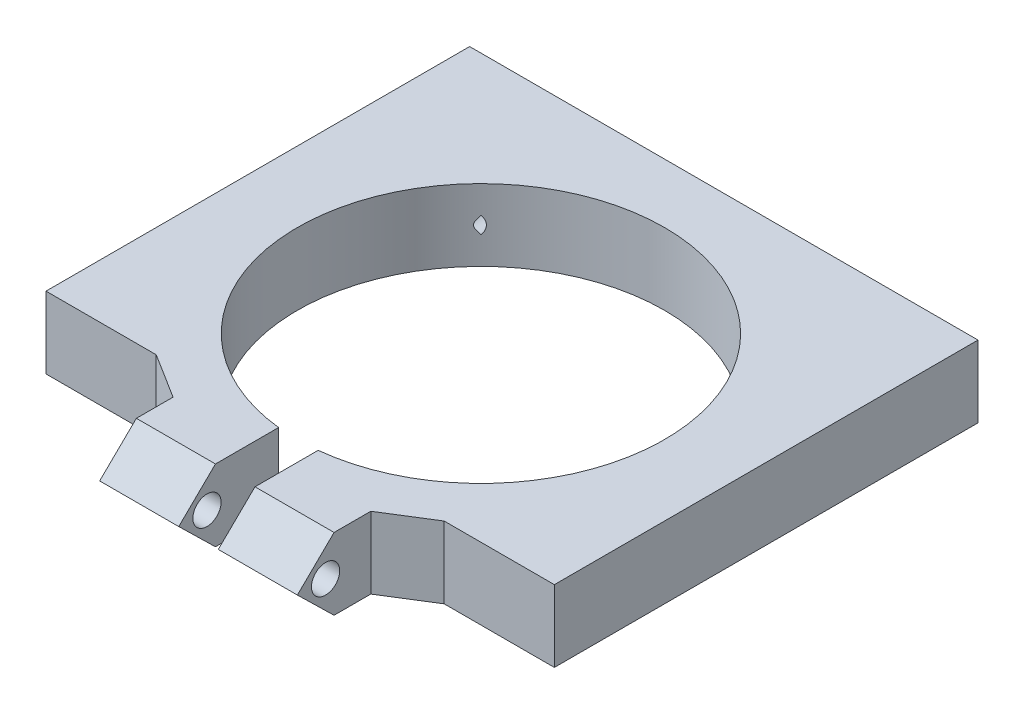
ISO-10303-21;
HEADER;
FILE_DESCRIPTION(('STEP AP214'),'2;1');
FILE_NAME('part.step','',(''),(''),'','','');
FILE_SCHEMA(('AUTOMOTIVE_DESIGN { 1 0 10303 214 1 1 1 1 }'));
ENDSEC;
DATA;
#1=APPLICATION_CONTEXT('core data for automotive mechanical design processes');
#2=APPLICATION_PROTOCOL_DEFINITION('international standard','automotive_design',2000,#1);
#3=PRODUCT_CONTEXT('',#1,'mechanical');
#4=PRODUCT('Part','Part','',(#3));
#5=PRODUCT_RELATED_PRODUCT_CATEGORY('part','',(#4));
#6=PRODUCT_DEFINITION_FORMATION('','',#4);
#7=PRODUCT_DEFINITION_CONTEXT('part definition',#1,'design');
#8=PRODUCT_DEFINITION('design','',#6,#7);
#9=PRODUCT_DEFINITION_SHAPE('','',#8);
#10=(LENGTH_UNIT() NAMED_UNIT(*) SI_UNIT(.MILLI.,.METRE.));
#11=(NAMED_UNIT(*) PLANE_ANGLE_UNIT() SI_UNIT($,.RADIAN.));
#12=(NAMED_UNIT(*) SI_UNIT($,.STERADIAN.) SOLID_ANGLE_UNIT());
#13=UNCERTAINTY_MEASURE_WITH_UNIT(LENGTH_MEASURE(1.E-05),#10,'distance_accuracy_value','');
#14=(GEOMETRIC_REPRESENTATION_CONTEXT(3) GLOBAL_UNCERTAINTY_ASSIGNED_CONTEXT((#13)) GLOBAL_UNIT_ASSIGNED_CONTEXT((#10,
#11,#12)) REPRESENTATION_CONTEXT('',''));
#15=CARTESIAN_POINT('',(0.,0.,0.));
#16=DIRECTION('',(0.,0.,1.));
#17=DIRECTION('',(1.,0.,0.));
#18=AXIS2_PLACEMENT_3D('',#15,#16,#17);
#19=CARTESIAN_POINT('',(45.,0.,-46.5));
#20=DIRECTION('',(0.,-1.,0.));
#21=DIRECTION('',(0.,0.,-1.));
#22=AXIS2_PLACEMENT_3D('',#19,#20,#21);
#23=PLANE('',#22);
#24=DIRECTION('',(-0.847998304005088,0.,0.52999894000318));
#25=VECTOR('',#24,1.);
#26=CARTESIAN_POINT('',(25.5,0.,28.5));
#27=LINE('',#26,#25);
#28=CARTESIAN_POINT('',(25.5,0.,28.5));
#29=VERTEX_POINT('',#28);
#30=CARTESIAN_POINT('',(17.5,0.,33.5));
#31=VERTEX_POINT('',#30);
#32=EDGE_CURVE('E219',#29,#31,#27,.T.);
#33=ORIENTED_EDGE('',*,*,#32,.T.);
#34=DIRECTION('',(0.,0.,1.));
#35=VECTOR('',#34,1.);
#36=CARTESIAN_POINT('',(17.5,0.,46.5));
#37=LINE('',#36,#35);
#38=CARTESIAN_POINT('',(17.5,0.,40.));
#39=VERTEX_POINT('',#38);
#40=EDGE_CURVE('E310',#31,#39,#37,.T.);
#41=ORIENTED_EDGE('',*,*,#40,.T.);
#42=DIRECTION('',(-1.,0.,0.));
#43=VECTOR('',#42,1.);
#44=CARTESIAN_POINT('',(26.5869411795169,0.,40.));
#45=LINE('',#44,#43);
#46=CARTESIAN_POINT('',(3.50000000000001,0.,40.));
#47=VERTEX_POINT('',#46);
#48=EDGE_CURVE('E250',#39,#47,#45,.T.);
#49=ORIENTED_EDGE('',*,*,#48,.T.);
#50=DIRECTION('',(0.,0.,-1.));
#51=VECTOR('',#50,1.);
#52=CARTESIAN_POINT('',(3.50000000000001,0.,46.5));
#53=LINE('',#52,#51);
#54=CARTESIAN_POINT('',(3.50000000000001,0.,28.8210473221398));
#55=VERTEX_POINT('',#54);
#56=EDGE_CURVE('E292',#47,#55,#53,.T.);
#57=ORIENTED_EDGE('',*,*,#56,.T.);
#58=CARTESIAN_POINT('',(0.,0.,-3.5));
#59=DIRECTION('',(0.,1.,0.));
#60=DIRECTION('',(0.,0.,1.));
#61=AXIS2_PLACEMENT_3D('',#58,#59,#60);
#62=CIRCLE('',#61,32.51);
#63=CARTESIAN_POINT('',(-3.49999999999999,0.,28.8210473221398));
#64=VERTEX_POINT('',#63);
#65=EDGE_CURVE('E320',#55,#64,#62,.T.);
#66=ORIENTED_EDGE('',*,*,#65,.T.);
#67=DIRECTION('',(0.,0.,1.));
#68=VECTOR('',#67,1.);
#69=CARTESIAN_POINT('',(-3.49999999999999,0.,46.5));
#70=LINE('',#69,#68);
#71=CARTESIAN_POINT('',(-3.49999999999999,0.,40.));
#72=VERTEX_POINT('',#71);
#73=EDGE_CURVE('E299',#64,#72,#70,.T.);
#74=ORIENTED_EDGE('',*,*,#73,.T.);
#75=CARTESIAN_POINT('',(-17.5,0.,40.));
#76=VERTEX_POINT('',#75);
#77=EDGE_CURVE('E254',#72,#76,#45,.T.);
#78=ORIENTED_EDGE('',*,*,#77,.T.);
#79=DIRECTION('',(0.,0.,-1.));
#80=VECTOR('',#79,1.);
#81=CARTESIAN_POINT('',(-17.5,0.,46.5));
#82=LINE('',#81,#80);
#83=CARTESIAN_POINT('',(-17.5,0.,33.5));
#84=VERTEX_POINT('',#83);
#85=EDGE_CURVE('E302',#76,#84,#82,.T.);
#86=ORIENTED_EDGE('',*,*,#85,.T.);
#87=DIRECTION('',(-0.847998304005088,0.,-0.52999894000318));
#88=VECTOR('',#87,1.);
#89=CARTESIAN_POINT('',(-25.5,0.,28.5));
#90=LINE('',#89,#88);
#91=CARTESIAN_POINT('',(-25.5,0.,28.5));
#92=VERTEX_POINT('',#91);
#93=EDGE_CURVE('E234',#84,#92,#90,.T.);
#94=ORIENTED_EDGE('',*,*,#93,.T.);
#95=DIRECTION('',(-1.,0.,0.));
#96=VECTOR('',#95,1.);
#97=CARTESIAN_POINT('',(-45.,0.,28.5));
#98=LINE('',#97,#96);
#99=CARTESIAN_POINT('',(-45.,0.,28.5));
#100=VERTEX_POINT('',#99);
#101=EDGE_CURVE('E237',#92,#100,#98,.T.);
#102=ORIENTED_EDGE('',*,*,#101,.T.);
#103=DIRECTION('',(0.,0.,1.));
#104=VECTOR('',#103,1.);
#105=CARTESIAN_POINT('',(-45.,0.,-46.5));
#106=LINE('',#105,#104);
#107=CARTESIAN_POINT('',(-45.,0.,-46.5));
#108=VERTEX_POINT('',#107);
#109=EDGE_CURVE('E330',#108,#100,#106,.T.);
#110=ORIENTED_EDGE('',*,*,#109,.F.);
#111=DIRECTION('',(1.,0.,0.));
#112=VECTOR('',#111,1.);
#113=CARTESIAN_POINT('',(-45.,0.,-46.5));
#114=LINE('',#113,#112);
#115=CARTESIAN_POINT('',(45.,0.,-46.5));
#116=VERTEX_POINT('',#115);
#117=EDGE_CURVE('E323',#108,#116,#114,.T.);
#118=ORIENTED_EDGE('',*,*,#117,.T.);
#119=DIRECTION('',(0.,0.,1.));
#120=VECTOR('',#119,1.);
#121=CARTESIAN_POINT('',(45.,0.,-46.5));
#122=LINE('',#121,#120);
#123=CARTESIAN_POINT('',(45.,0.,28.5));
#124=VERTEX_POINT('',#123);
#125=EDGE_CURVE('E339',#116,#124,#122,.T.);
#126=ORIENTED_EDGE('',*,*,#125,.T.);
#127=DIRECTION('',(-1.,0.,0.));
#128=VECTOR('',#127,1.);
#129=CARTESIAN_POINT('',(45.,0.,28.5));
#130=LINE('',#129,#128);
#131=EDGE_CURVE('E222',#124,#29,#130,.T.);
#132=ORIENTED_EDGE('',*,*,#131,.T.);
#133=EDGE_LOOP('',(#33,#41,#49,#57,#66,#74,#78,#86,#94,#102,#110,#118,#126,#132));
#134=FACE_BOUND('',#133,.T.);
#135=ADVANCED_FACE('F49',(#134),#23,.T.);
#136=CARTESIAN_POINT('',(17.5,-0.000999999999999265,46.5));
#137=DIRECTION('',(-1.,0.,0.));
#138=DIRECTION('',(0.,0.,1.));
#139=AXIS2_PLACEMENT_3D('',#136,#137,#138);
#140=PLANE('',#139);
#141=CARTESIAN_POINT('',(17.5,6.35,41.5));
#142=DIRECTION('',(-1.,0.,0.));
#143=DIRECTION('',(0.,0.,1.));
#144=AXIS2_PLACEMENT_3D('',#141,#142,#143);
#145=CIRCLE('',#144,2.5);
#146=CARTESIAN_POINT('',(17.5,6.35,44.));
#147=VERTEX_POINT('',#146);
#148=EDGE_CURVE('E280',#147,#147,#145,.F.);
#149=ORIENTED_EDGE('',*,*,#148,.F.);
#150=EDGE_LOOP('',(#149));
#151=FACE_BOUND('',#150,.T.);
#152=DIRECTION('',(0.,-0.698805007598563,-0.715312212502465));
#153=VECTOR('',#152,1.);
#154=CARTESIAN_POINT('',(17.5,-3.8711672263006,36.0373878785899));
#155=LINE('',#154,#153);
#156=CARTESIAN_POINT('',(17.5,6.35,46.5));
#157=VERTEX_POINT('',#156);
#158=EDGE_CURVE('E248',#157,#39,#155,.T.);
#159=ORIENTED_EDGE('',*,*,#158,.T.);
#160=ORIENTED_EDGE('',*,*,#40,.F.);
#161=DIRECTION('',(0.,1.,0.));
#162=VECTOR('',#161,1.);
#163=CARTESIAN_POINT('',(17.5,-0.000999999999999265,33.5));
#164=LINE('',#163,#162);
#165=CARTESIAN_POINT('',(17.5,12.7,33.5));
#166=VERTEX_POINT('',#165);
#167=EDGE_CURVE('E316',#31,#166,#164,.T.);
#168=ORIENTED_EDGE('',*,*,#167,.T.);
#169=DIRECTION('',(0.,0.,1.));
#170=VECTOR('',#169,1.);
#171=CARTESIAN_POINT('',(17.5,12.7,46.5));
#172=LINE('',#171,#170);
#173=CARTESIAN_POINT('',(17.5,12.7,40.));
#174=VERTEX_POINT('',#173);
#175=EDGE_CURVE('E313',#166,#174,#172,.T.);
#176=ORIENTED_EDGE('',*,*,#175,.T.);
#177=DIRECTION('',(0.,0.698805007598563,-0.715312212502465));
#178=VECTOR('',#177,1.);
#179=CARTESIAN_POINT('',(17.5,2.6270616029101,50.3108818237928));
#180=LINE('',#179,#178);
#181=EDGE_CURVE('E269',#157,#174,#180,.T.);
#182=ORIENTED_EDGE('',*,*,#181,.F.);
#183=EDGE_LOOP('',(#159,#160,#168,#176,#182));
#184=FACE_BOUND('',#183,.T.);
#185=ADVANCED_FACE('F418',(#151,#184),#140,.F.);
#186=CARTESIAN_POINT('',(-17.5,-0.000999999999999265,46.5));
#187=DIRECTION('',(1.,0.,0.));
#188=DIRECTION('',(0.,0.,-1.));
#189=AXIS2_PLACEMENT_3D('',#186,#187,#188);
#190=PLANE('',#189);
#191=CARTESIAN_POINT('',(-17.5,6.35,41.5));
#192=DIRECTION('',(-1.,0.,0.));
#193=DIRECTION('',(0.,0.,1.));
#194=AXIS2_PLACEMENT_3D('',#191,#192,#193);
#195=CIRCLE('',#194,2.5);
#196=CARTESIAN_POINT('',(-17.5,6.35,44.));
#197=VERTEX_POINT('',#196);
#198=EDGE_CURVE('E277',#197,#197,#195,.T.);
#199=ORIENTED_EDGE('',*,*,#198,.F.);
#200=EDGE_LOOP('',(#199));
#201=FACE_BOUND('',#200,.T.);
#202=DIRECTION('',(0.,0.698805007598563,0.715312212502465));
#203=VECTOR('',#202,1.);
#204=CARTESIAN_POINT('',(-17.5,-3.8711672263006,36.0373878785899));
#205=LINE('',#204,#203);
#206=CARTESIAN_POINT('',(-17.5,6.35,46.5));
#207=VERTEX_POINT('',#206);
#208=EDGE_CURVE('E253',#76,#207,#205,.T.);
#209=ORIENTED_EDGE('',*,*,#208,.T.);
#210=DIRECTION('',(0.,-0.698805007598563,0.715312212502465));
#211=VECTOR('',#210,1.);
#212=CARTESIAN_POINT('',(-17.5,2.6270616029101,50.3108818237928));
#213=LINE('',#212,#211);
#214=CARTESIAN_POINT('',(-17.5,12.7,40.));
#215=VERTEX_POINT('',#214);
#216=EDGE_CURVE('E263',#215,#207,#213,.T.);
#217=ORIENTED_EDGE('',*,*,#216,.F.);
#218=DIRECTION('',(0.,0.,-1.));
#219=VECTOR('',#218,1.);
#220=CARTESIAN_POINT('',(-17.5,12.7,46.5));
#221=LINE('',#220,#219);
#222=CARTESIAN_POINT('',(-17.5,12.7,33.5));
#223=VERTEX_POINT('',#222);
#224=EDGE_CURVE('E305',#215,#223,#221,.T.);
#225=ORIENTED_EDGE('',*,*,#224,.T.);
#226=DIRECTION('',(0.,1.,0.));
#227=VECTOR('',#226,1.);
#228=CARTESIAN_POINT('',(-17.5,-0.000999999999999265,33.5));
#229=LINE('',#228,#227);
#230=EDGE_CURVE('E308',#84,#223,#229,.T.);
#231=ORIENTED_EDGE('',*,*,#230,.F.);
#232=ORIENTED_EDGE('',*,*,#85,.F.);
#233=EDGE_LOOP('',(#209,#217,#225,#231,#232));
#234=FACE_BOUND('',#233,.T.);
#235=ADVANCED_FACE('F412',(#201,#234),#190,.F.);
#236=CARTESIAN_POINT('',(-3.49999999999999,-0.000999999999999265,46.5));
#237=DIRECTION('',(-1.,0.,0.));
#238=DIRECTION('',(0.,0.,1.));
#239=AXIS2_PLACEMENT_3D('',#236,#237,#238);
#240=PLANE('',#239);
#241=CARTESIAN_POINT('',(-3.49999999999999,6.35,41.5));
#242=DIRECTION('',(-1.,0.,0.));
#243=DIRECTION('',(0.,0.,1.));
#244=AXIS2_PLACEMENT_3D('',#241,#242,#243);
#245=CIRCLE('',#244,2.5);
#246=CARTESIAN_POINT('',(-3.49999999999999,6.35,44.));
#247=VERTEX_POINT('',#246);
#248=EDGE_CURVE('E284',#247,#247,#245,.T.);
#249=ORIENTED_EDGE('',*,*,#248,.T.);
#250=EDGE_LOOP('',(#249));
#251=FACE_BOUND('',#250,.T.);
#252=DIRECTION('',(0.,0.698805007598563,0.715312212502465));
#253=VECTOR('',#252,1.);
#254=CARTESIAN_POINT('',(-3.49999999999999,3.2486260861667,43.3253652850525));
#255=LINE('',#254,#253);
#256=CARTESIAN_POINT('',(-3.49999999999999,6.35,46.5));
#257=VERTEX_POINT('',#256);
#258=EDGE_CURVE('E261',#72,#257,#255,.T.);
#259=ORIENTED_EDGE('',*,*,#258,.F.);
#260=ORIENTED_EDGE('',*,*,#73,.F.);
#261=DIRECTION('',(0.,1.,0.));
#262=VECTOR('',#261,1.);
#263=CARTESIAN_POINT('',(-3.49999999999999,0.,28.8210473221398));
#264=LINE('',#263,#262);
#265=CARTESIAN_POINT('',(-3.49999999999999,12.7,28.8210473221398));
#266=VERTEX_POINT('',#265);
#267=EDGE_CURVE('E287',#64,#266,#264,.T.);
#268=ORIENTED_EDGE('',*,*,#267,.T.);
#269=DIRECTION('',(0.,0.,1.));
#270=VECTOR('',#269,1.);
#271=CARTESIAN_POINT('',(-3.49999999999999,12.7,46.5));
#272=LINE('',#271,#270);
#273=CARTESIAN_POINT('',(-3.49999999999999,12.7,40.));
#274=VERTEX_POINT('',#273);
#275=EDGE_CURVE('E296',#266,#274,#272,.T.);
#276=ORIENTED_EDGE('',*,*,#275,.T.);
#277=DIRECTION('',(0.,-0.698805007598563,0.715312212502465));
#278=VECTOR('',#277,1.);
#279=CARTESIAN_POINT('',(-3.49999999999999,3.2486260861667,49.6746347149475));
#280=LINE('',#279,#278);
#281=EDGE_CURVE('E274',#274,#257,#280,.T.);
#282=ORIENTED_EDGE('',*,*,#281,.T.);
#283=EDGE_LOOP('',(#259,#260,#268,#276,#282));
#284=FACE_BOUND('',#283,.T.);
#285=ADVANCED_FACE('F408',(#251,#284),#240,.F.);
#286=CARTESIAN_POINT('',(3.50000000000001,-0.000999999999999265,46.5));
#287=DIRECTION('',(1.,0.,0.));
#288=DIRECTION('',(0.,0.,-1.));
#289=AXIS2_PLACEMENT_3D('',#286,#287,#288);
#290=PLANE('',#289);
#291=CARTESIAN_POINT('',(3.50000000000001,6.35,41.5));
#292=DIRECTION('',(1.,0.,0.));
#293=DIRECTION('',(0.,0.,-1.));
#294=AXIS2_PLACEMENT_3D('',#291,#292,#293);
#295=CIRCLE('',#294,2.5);
#296=CARTESIAN_POINT('',(3.50000000000001,6.35,39.));
#297=VERTEX_POINT('',#296);
#298=EDGE_CURVE('E283',#297,#297,#295,.T.);
#299=ORIENTED_EDGE('',*,*,#298,.T.);
#300=EDGE_LOOP('',(#299));
#301=FACE_BOUND('',#300,.T.);
#302=DIRECTION('',(0.,-0.698805007598563,-0.715312212502465));
#303=VECTOR('',#302,1.);
#304=CARTESIAN_POINT('',(3.50000000000001,3.2486260861667,43.3253652850525));
#305=LINE('',#304,#303);
#306=CARTESIAN_POINT('',(3.50000000000001,6.35,46.5));
#307=VERTEX_POINT('',#306);
#308=EDGE_CURVE('E257',#307,#47,#305,.T.);
#309=ORIENTED_EDGE('',*,*,#308,.F.);
#310=DIRECTION('',(0.,0.698805007598563,-0.715312212502465));
#311=VECTOR('',#310,1.);
#312=CARTESIAN_POINT('',(3.50000000000001,3.2486260861667,49.6746347149475));
#313=LINE('',#312,#311);
#314=CARTESIAN_POINT('',(3.50000000000001,12.7,40.));
#315=VERTEX_POINT('',#314);
#316=EDGE_CURVE('E346',#307,#315,#313,.T.);
#317=ORIENTED_EDGE('',*,*,#316,.T.);
#318=DIRECTION('',(0.,0.,-1.));
#319=VECTOR('',#318,1.);
#320=CARTESIAN_POINT('',(3.50000000000001,12.7,46.5));
#321=LINE('',#320,#319);
#322=CARTESIAN_POINT('',(3.50000000000001,12.7,28.8210473221398));
#323=VERTEX_POINT('',#322);
#324=EDGE_CURVE('E294',#315,#323,#321,.T.);
#325=ORIENTED_EDGE('',*,*,#324,.T.);
#326=DIRECTION('',(0.,1.,0.));
#327=VECTOR('',#326,1.);
#328=CARTESIAN_POINT('',(3.50000000000001,0.,28.8210473221398));
#329=LINE('',#328,#327);
#330=EDGE_CURVE('E289',#323,#55,#329,.F.);
#331=ORIENTED_EDGE('',*,*,#330,.T.);
#332=ORIENTED_EDGE('',*,*,#56,.F.);
#333=EDGE_LOOP('',(#309,#317,#325,#331,#332));
#334=FACE_BOUND('',#333,.T.);
#335=ADVANCED_FACE('F411',(#301,#334),#290,.F.);
#336=CARTESIAN_POINT('',(-45.,12.7,-46.5));
#337=DIRECTION('',(0.,0.,-1.));
#338=DIRECTION('',(-1.,0.,0.));
#339=AXIS2_PLACEMENT_3D('',#336,#337,#338);
#340=PLANE('',#339);
#341=CARTESIAN_POINT('',(40.,6.35,-46.5));
#342=DIRECTION('',(0.,0.,-1.));
#343=DIRECTION('',(-1.,0.,0.));
#344=AXIS2_PLACEMENT_3D('',#341,#342,#343);
#345=CIRCLE('',#344,2.5);
#346=CARTESIAN_POINT('',(37.5,6.35,-46.5));
#347=VERTEX_POINT('',#346);
#348=EDGE_CURVE('E200',#347,#347,#345,.T.);
#349=ORIENTED_EDGE('',*,*,#348,.F.);
#350=EDGE_LOOP('',(#349));
#351=FACE_BOUND('',#350,.T.);
#352=CARTESIAN_POINT('',(25.,6.35,-46.5));
#353=DIRECTION('',(0.,0.,-1.));
#354=DIRECTION('',(-1.,0.,0.));
#355=AXIS2_PLACEMENT_3D('',#352,#353,#354);
#356=CIRCLE('',#355,2.5);
#357=CARTESIAN_POINT('',(22.5,6.35,-46.5));
#358=VERTEX_POINT('',#357);
#359=EDGE_CURVE('E199',#358,#358,#356,.T.);
#360=ORIENTED_EDGE('',*,*,#359,.F.);
#361=EDGE_LOOP('',(#360));
#362=FACE_BOUND('',#361,.T.);
#363=CARTESIAN_POINT('',(-40.,6.35000000000001,-46.5));
#364=DIRECTION('',(0.,0.,-1.));
#365=DIRECTION('',(-1.,0.,0.));
#366=AXIS2_PLACEMENT_3D('',#363,#364,#365);
#367=CIRCLE('',#366,2.5);
#368=CARTESIAN_POINT('',(-42.5,6.35000000000001,-46.5));
#369=VERTEX_POINT('',#368);
#370=EDGE_CURVE('E208',#369,#369,#367,.T.);
#371=ORIENTED_EDGE('',*,*,#370,.F.);
#372=EDGE_LOOP('',(#371));
#373=FACE_BOUND('',#372,.T.);
#374=CARTESIAN_POINT('',(-25.,6.35000000000001,-46.5));
#375=DIRECTION('',(0.,0.,-1.));
#376=DIRECTION('',(-1.,0.,0.));
#377=AXIS2_PLACEMENT_3D('',#374,#375,#376);
#378=CIRCLE('',#377,2.5);
#379=CARTESIAN_POINT('',(-27.5,6.35000000000001,-46.5));
#380=VERTEX_POINT('',#379);
#381=EDGE_CURVE('E214',#380,#380,#378,.T.);
#382=ORIENTED_EDGE('',*,*,#381,.F.);
#383=EDGE_LOOP('',(#382));
#384=FACE_BOUND('',#383,.T.);
#385=ORIENTED_EDGE('',*,*,#117,.F.);
#386=DIRECTION('',(0.,-1.,0.));
#387=VECTOR('',#386,1.);
#388=CARTESIAN_POINT('',(-45.,12.7,-46.5));
#389=LINE('',#388,#387);
#390=CARTESIAN_POINT('',(-45.,12.7,-46.5));
#391=VERTEX_POINT('',#390);
#392=EDGE_CURVE('E344',#391,#108,#389,.T.);
#393=ORIENTED_EDGE('',*,*,#392,.F.);
#394=DIRECTION('',(1.,0.,0.));
#395=VECTOR('',#394,1.);
#396=CARTESIAN_POINT('',(-45.,12.7,-46.5));
#397=LINE('',#396,#395);
#398=CARTESIAN_POINT('',(45.,12.7,-46.5));
#399=VERTEX_POINT('',#398);
#400=EDGE_CURVE('E326',#391,#399,#397,.T.);
#401=ORIENTED_EDGE('',*,*,#400,.T.);
#402=DIRECTION('',(0.,-1.,0.));
#403=VECTOR('',#402,1.);
#404=CARTESIAN_POINT('',(45.,12.7,-46.5));
#405=LINE('',#404,#403);
#406=EDGE_CURVE('E336',#399,#116,#405,.T.);
#407=ORIENTED_EDGE('',*,*,#406,.T.);
#408=EDGE_LOOP('',(#385,#393,#401,#407));
#409=FACE_BOUND('',#408,.T.);
#410=ADVANCED_FACE('F51',(#351,#362,#373,#384,#409),#340,.T.);
#411=CARTESIAN_POINT('',(-45.,12.7,-46.5));
#412=DIRECTION('',(1.,0.,0.));
#413=DIRECTION('',(0.,0.,-1.));
#414=AXIS2_PLACEMENT_3D('',#411,#412,#413);
#415=PLANE('',#414);
#416=ORIENTED_EDGE('',*,*,#109,.T.);
#417=DIRECTION('',(0.,1.,0.));
#418=VECTOR('',#417,1.);
#419=CARTESIAN_POINT('',(-45.,0.,28.5));
#420=LINE('',#419,#418);
#421=CARTESIAN_POINT('',(-45.,12.7,28.5));
#422=VERTEX_POINT('',#421);
#423=EDGE_CURVE('E245',#100,#422,#420,.T.);
#424=ORIENTED_EDGE('',*,*,#423,.T.);
#425=DIRECTION('',(0.,0.,1.));
#426=VECTOR('',#425,1.);
#427=CARTESIAN_POINT('',(-45.,12.7,-46.5));
#428=LINE('',#427,#426);
#429=EDGE_CURVE('E333',#391,#422,#428,.T.);
#430=ORIENTED_EDGE('',*,*,#429,.F.);
#431=ORIENTED_EDGE('',*,*,#392,.T.);
#432=EDGE_LOOP('',(#416,#424,#430,#431));
#433=FACE_BOUND('',#432,.T.);
#434=ADVANCED_FACE('F618',(#433),#415,.F.);
#435=CARTESIAN_POINT('',(45.,12.7,-46.5));
#436=DIRECTION('',(1.,0.,0.));
#437=DIRECTION('',(0.,0.,-1.));
#438=AXIS2_PLACEMENT_3D('',#435,#436,#437);
#439=PLANE('',#438);
#440=DIRECTION('',(0.,1.,0.));
#441=VECTOR('',#440,1.);
#442=CARTESIAN_POINT('',(45.,0.,28.5));
#443=LINE('',#442,#441);
#444=CARTESIAN_POINT('',(45.,12.7,28.5));
#445=VERTEX_POINT('',#444);
#446=EDGE_CURVE('E226',#124,#445,#443,.T.);
#447=ORIENTED_EDGE('',*,*,#446,.F.);
#448=ORIENTED_EDGE('',*,*,#125,.F.);
#449=ORIENTED_EDGE('',*,*,#406,.F.);
#450=DIRECTION('',(0.,0.,1.));
#451=VECTOR('',#450,1.);
#452=CARTESIAN_POINT('',(45.,12.7,-46.5));
#453=LINE('',#452,#451);
#454=EDGE_CURVE('E329',#399,#445,#453,.T.);
#455=ORIENTED_EDGE('',*,*,#454,.T.);
#456=EDGE_LOOP('',(#447,#448,#449,#455));
#457=FACE_BOUND('',#456,.T.);
#458=ADVANCED_FACE('F611',(#457),#439,.T.);
#459=CARTESIAN_POINT('',(45.,12.7,-46.5));
#460=DIRECTION('',(0.,-1.,0.));
#461=DIRECTION('',(0.,0.,-1.));
#462=AXIS2_PLACEMENT_3D('',#459,#460,#461);
#463=PLANE('',#462);
#464=ORIENTED_EDGE('',*,*,#175,.F.);
#465=DIRECTION('',(-0.847998304005088,0.,0.52999894000318));
#466=VECTOR('',#465,1.);
#467=CARTESIAN_POINT('',(25.5,12.7,28.5));
#468=LINE('',#467,#466);
#469=CARTESIAN_POINT('',(25.5,12.7,28.5));
#470=VERTEX_POINT('',#469);
#471=EDGE_CURVE('E218',#470,#166,#468,.T.);
#472=ORIENTED_EDGE('',*,*,#471,.F.);
#473=DIRECTION('',(-1.,0.,0.));
#474=VECTOR('',#473,1.);
#475=CARTESIAN_POINT('',(45.,12.7,28.5));
#476=LINE('',#475,#474);
#477=EDGE_CURVE('E223',#445,#470,#476,.T.);
#478=ORIENTED_EDGE('',*,*,#477,.F.);
#479=ORIENTED_EDGE('',*,*,#454,.F.);
#480=ORIENTED_EDGE('',*,*,#400,.F.);
#481=ORIENTED_EDGE('',*,*,#429,.T.);
#482=DIRECTION('',(-1.,0.,0.));
#483=VECTOR('',#482,1.);
#484=CARTESIAN_POINT('',(-45.,12.7,28.5));
#485=LINE('',#484,#483);
#486=CARTESIAN_POINT('',(-25.5,12.7,28.5));
#487=VERTEX_POINT('',#486);
#488=EDGE_CURVE('E238',#487,#422,#485,.T.);
#489=ORIENTED_EDGE('',*,*,#488,.F.);
#490=DIRECTION('',(-0.847998304005088,0.,-0.52999894000318));
#491=VECTOR('',#490,1.);
#492=CARTESIAN_POINT('',(-25.5,12.7,28.5));
#493=LINE('',#492,#491);
#494=EDGE_CURVE('E232',#223,#487,#493,.T.);
#495=ORIENTED_EDGE('',*,*,#494,.F.);
#496=ORIENTED_EDGE('',*,*,#224,.F.);
#497=DIRECTION('',(-1.,0.,0.));
#498=VECTOR('',#497,1.);
#499=CARTESIAN_POINT('',(26.5869411795169,12.7,40.));
#500=LINE('',#499,#498);
#501=EDGE_CURVE('E266',#274,#215,#500,.T.);
#502=ORIENTED_EDGE('',*,*,#501,.F.);
#503=ORIENTED_EDGE('',*,*,#275,.F.);
#504=CARTESIAN_POINT('',(0.,12.7,-3.5));
#505=DIRECTION('',(0.,1.,0.));
#506=DIRECTION('',(0.,0.,1.));
#507=AXIS2_PLACEMENT_3D('',#504,#505,#506);
#508=CIRCLE('',#507,32.51);
#509=EDGE_CURVE('E319',#323,#266,#508,.T.);
#510=ORIENTED_EDGE('',*,*,#509,.F.);
#511=ORIENTED_EDGE('',*,*,#324,.F.);
#512=EDGE_CURVE('E271',#174,#315,#500,.T.);
#513=ORIENTED_EDGE('',*,*,#512,.F.);
#514=EDGE_LOOP('',(#464,#472,#478,#479,#480,#481,#489,#495,#496,#502,#503,#510,#511,#513));
#515=FACE_BOUND('',#514,.T.);
#516=ADVANCED_FACE('F439',(#515),#463,.F.);
#517=CARTESIAN_POINT('',(0.,0.,-3.5));
#518=DIRECTION('',(0.,1.,0.));
#519=DIRECTION('',(0.,0.,1.));
#520=AXIS2_PLACEMENT_3D('',#517,#518,#519);
#521=CYLINDRICAL_SURFACE('',#520,32.51);
#522=CARTESIAN_POINT('',(22.8245126599102,8.03273160406904,-26.6504151547569));
#523=CARTESIAN_POINT('',(22.8578856965579,7.98636449310996,-26.6175123290705));
#524=CARTESIAN_POINT('',(22.891008675288,7.93974203354632,-26.5847129246827));
#525=CARTESIAN_POINT('',(22.9566891760717,7.84588563691829,-26.519397540114));
#526=CARTESIAN_POINT('',(22.9892465809804,7.79865157662992,-26.4868816193284));
#527=CARTESIAN_POINT('',(23.0537943288036,7.70337577493946,-26.4221456388135));
#528=CARTESIAN_POINT('',(23.0857831211278,7.65533236547621,-26.3899264777613));
#529=CARTESIAN_POINT('',(23.1489844194344,7.55840735884757,-26.3260080579623));
#530=CARTESIAN_POINT('',(23.1801969940413,7.50952583642899,-26.2943087533405));
#531=CARTESIAN_POINT('',(23.2590788967889,7.382789437945,-26.2138735163471));
#532=CARTESIAN_POINT('',(23.3060741730503,7.30418038549304,-26.1656393702641));
#533=CARTESIAN_POINT('',(23.3738683234472,7.18331859036884,-26.0956509908601));
#534=CARTESIAN_POINT('',(23.3960253185399,7.14252219981247,-26.0727061971481));
#535=CARTESIAN_POINT('',(23.4390981071229,7.05966424275348,-26.0279768765211));
#536=CARTESIAN_POINT('',(23.4600142197385,7.01760300576876,-26.0061920514391));
#537=CARTESIAN_POINT('',(23.5059670693648,6.91935791909232,-25.9582057407222));
#538=CARTESIAN_POINT('',(23.5304325929671,6.86262504219482,-25.93256286246));
#539=CARTESIAN_POINT('',(23.5745751364237,6.74534391453878,-25.8861681196865));
#540=CARTESIAN_POINT('',(23.5942625378758,6.68480430206191,-25.8654056544754));
#541=CARTESIAN_POINT('',(23.6199923856961,6.58064178994387,-25.8382248639014));
#542=CARTESIAN_POINT('',(23.6283985402674,6.53829551996295,-25.8293294257176));
#543=CARTESIAN_POINT('',(23.6402392454988,6.45223132946878,-25.8167933840262));
#544=CARTESIAN_POINT('',(23.6436921342987,6.40851908379417,-25.8131333978038));
#545=CARTESIAN_POINT('',(23.6449374529276,6.32069789811384,-25.8118137928911));
#546=CARTESIAN_POINT('',(23.6427023436774,6.27658806238417,-25.8141833669864));
#547=CARTESIAN_POINT('',(23.633004266395,6.18955263399944,-25.8244542073858));
#548=CARTESIAN_POINT('',(23.6255253722807,6.14663106414846,-25.8323723253238));
#549=CARTESIAN_POINT('',(23.600639624617,6.03608351577937,-25.85867597429));
#550=CARTESIAN_POINT('',(23.5799442311175,5.97007471114548,-25.8805154938971));
#551=CARTESIAN_POINT('',(23.5445138541337,5.87433765582256,-25.9177669864368));
#552=CARTESIAN_POINT('',(23.5318910852058,5.84280779682581,-25.9310180168143));
#553=CARTESIAN_POINT('',(23.50552250207,5.78072629625319,-25.9586480884082));
#554=CARTESIAN_POINT('',(23.4917771682375,5.7501742439576,-25.9730266470212));
#555=CARTESIAN_POINT('',(23.4540029784296,5.66979475852147,-26.0124633509558));
#556=CARTESIAN_POINT('',(23.4292244389558,5.62068765144205,-26.0382539589711));
#557=CARTESIAN_POINT('',(23.378081630857,5.52410698990929,-26.0912984265672));
#558=CARTESIAN_POINT('',(23.3517166944214,5.47663413682066,-26.1185529018527));
#559=CARTESIAN_POINT('',(23.2708227252097,5.33584904990829,-26.2018696164429));
#560=CARTESIAN_POINT('',(23.2145973332559,5.24437569355004,-26.2593775980994));
#561=CARTESIAN_POINT('',(23.1034632485375,5.07083572225966,-26.3721651358271));
#562=CARTESIAN_POINT('',(23.04874189283,4.98856095318612,-26.4273153351782));
#563=CARTESIAN_POINT('',(22.9654316267715,4.86681135405185,-26.5106623909107));
#564=CARTESIAN_POINT('',(22.937528648249,4.8266044498359,-26.5384775308314));
#565=CARTESIAN_POINT('',(22.8813160484351,4.74662492110061,-26.5943076730212));
#566=CARTESIAN_POINT('',(22.8530064745531,4.70685224688628,-26.6223226518002));
#567=CARTESIAN_POINT('',(22.824512659912,4.66726839592857,-26.6504151547554));
#568=B_SPLINE_CURVE_WITH_KNOTS('',3,(#522,#523,#524,#525,#526,#527,#528,#529,#530,#531,#532,
#533,#534,#535,#536,#537,#538,#539,#540,#541,#542,#543,#544,#545,#546,#547,#548,#549,#550,#551,
#552,#553,#554,#555,#556,#557,#558,#559,#560,#561,#562,#563,#564,#565,#566,#567),.UNSPECIFIED.,
.F.,.F.,(4,2,2,2,2,2,2,2,2,2,2,2,2,2,2,2,2,2,2,2,2,2,4),(0.,0.197779374062787,0.395599236268489,
0.593894443323957,0.79217205653909,1.10256375846405,1.25789014921333,1.4131764190265,
1.61363397559775,1.81365201140078,1.94541778253308,2.07669445592724,2.20860792799752,
2.34092378435056,2.55724876985542,2.66661614841213,2.77593696853813,2.95809700104627,
3.14033425963447,3.5055679928483,3.84501355391799,4.01388770531375,4.18274232311147),.UNSPECIFIED.);
#569=CARTESIAN_POINT('',(22.9760766885907,7.81756070727378,-26.5));
#570=VERTEX_POINT('',#569);
#571=CARTESIAN_POINT('',(22.9760766885914,4.8824392927263,-26.4999999999994));
#572=VERTEX_POINT('',#571);
#573=EDGE_CURVE('E62',#570,#572,#568,.T.);
#574=ORIENTED_EDGE('',*,*,#573,.T.);
#575=CARTESIAN_POINT('',(22.9760766885907,4.88243929272623,-26.5));
#576=CARTESIAN_POINT('',(22.945514434068,4.92459328627809,-26.5305310471415));
#577=CARTESIAN_POINT('',(22.9159025029324,4.96819945693463,-26.5599897842512));
#578=CARTESIAN_POINT('',(22.8588563247327,5.05835014076838,-26.6165394731979));
#579=CARTESIAN_POINT('',(22.8314242528938,5.10489750778826,-26.6436280625835));
#580=CARTESIAN_POINT('',(22.7525581731281,5.249504382547,-26.7212543538606));
#581=CARTESIAN_POINT('',(22.7049648096278,5.35197390270439,-26.7677438932206));
#582=CARTESIAN_POINT('',(22.6227620718382,5.56761482671347,-26.8476781930616));
#583=CARTESIAN_POINT('',(22.5882313826983,5.68084610094242,-26.8810439466682));
#584=CARTESIAN_POINT('',(22.5354072432105,5.91411985514963,-26.9319631870418));
#585=CARTESIAN_POINT('',(22.517054873915,6.03413591167557,-26.949574054183));
#586=CARTESIAN_POINT('',(22.4991453082455,6.26348061304514,-26.966757064898));
#587=CARTESIAN_POINT('',(22.4977466458129,6.37253686409296,-26.9680965956538));
#588=CARTESIAN_POINT('',(22.5091114840635,6.58925362646505,-26.957196386427));
#589=CARTESIAN_POINT('',(22.5218788034205,6.69691375352471,-26.9449529849413));
#590=CARTESIAN_POINT('',(22.5594299695076,6.90114805479923,-26.908819592752));
#591=CARTESIAN_POINT('',(22.5834476796913,6.99799991995029,-26.885671682314));
#592=CARTESIAN_POINT('',(22.6417197685429,7.18556811976714,-26.8292577228296));
#593=CARTESIAN_POINT('',(22.6759869852086,7.27627658374052,-26.7959789834997));
#594=CARTESIAN_POINT('',(22.7513866028538,7.44637099299945,-26.7223414520289));
#595=CARTESIAN_POINT('',(22.7921661953777,7.52607398575164,-26.6823428033375));
#596=CARTESIAN_POINT('',(22.8798680747625,7.67766573761631,-26.595791182659));
#597=CARTESIAN_POINT('',(22.926762931203,7.74958691255873,-26.5492674130405));
#598=CARTESIAN_POINT('',(22.9760766885907,7.81756070727378,-26.5));
#599=B_SPLINE_CURVE_WITH_KNOTS('',3,(#575,#576,#577,#578,#579,#580,#581,#582,#583,#584,#585,
#586,#587,#588,#589,#590,#591,#592,#593,#594,#595,#596,#597,#598),.UNSPECIFIED.,.F.,.F.,(4,2,2,
2,2,2,2,2,2,2,2,4),(0.,0.181011106495342,0.362200628429952,0.726961895857972,1.09388664122208,
1.45946951601222,1.78493582808804,2.11048989628926,2.41653036358971,2.72295577802283,
3.0163849789454,3.30854056078505),.UNSPECIFIED.);
#600=EDGE_CURVE('E12',#572,#570,#599,.T.);
#601=ORIENTED_EDGE('',*,*,#600,.T.);
#602=EDGE_LOOP('',(#574,#601));
#603=FACE_BOUND('',#602,.T.);
#604=CARTESIAN_POINT('',(-22.8245126599099,4.66726839593048,-26.6504151547572));
#605=CARTESIAN_POINT('',(-22.8578856965575,4.71363550688955,-26.6175123290708));
#606=CARTESIAN_POINT('',(-22.8910086752876,4.76025796645317,-26.5847129246831));
#607=CARTESIAN_POINT('',(-22.9566891760713,4.85411436308117,-26.5193975401144));
#608=CARTESIAN_POINT('',(-22.98924658098,4.90134842336952,-26.4868816193288));
#609=CARTESIAN_POINT('',(-23.0537943288032,4.99662422505995,-26.4221456388139));
#610=CARTESIAN_POINT('',(-23.0857831211274,5.04466763452318,-26.3899264777617));
#611=CARTESIAN_POINT('',(-23.1489844194339,5.14159264115178,-26.3260080579628));
#612=CARTESIAN_POINT('',(-23.1801969940408,5.19047416357033,-26.294308753341));
#613=CARTESIAN_POINT('',(-23.2590788967884,5.31721056205412,-26.2138735163476));
#614=CARTESIAN_POINT('',(-23.3060741730497,5.39581961450592,-26.1656393702647));
#615=CARTESIAN_POINT('',(-23.3738683234465,5.51668140962984,-26.0956509908609));
#616=CARTESIAN_POINT('',(-23.3960253185391,5.55747780018611,-26.0727061971489));
#617=CARTESIAN_POINT('',(-23.4390981071221,5.6403357572449,-26.027976876522));
#618=CARTESIAN_POINT('',(-23.4600142197376,5.68239699422952,-26.00619205144));
#619=CARTESIAN_POINT('',(-23.5059670693642,5.78064208090614,-25.9582057407229));
#620=CARTESIAN_POINT('',(-23.5304325929666,5.83737495780395,-25.9325628624605));
#621=CARTESIAN_POINT('',(-23.5745751364235,5.95465608546062,-25.8861681196867));
#622=CARTESIAN_POINT('',(-23.5942625378757,6.01519569793783,-25.8654056544754));
#623=CARTESIAN_POINT('',(-23.6199923856961,6.11935821005623,-25.8382248639014));
#624=CARTESIAN_POINT('',(-23.6283985402674,6.16170448003715,-25.8293294257176));
#625=CARTESIAN_POINT('',(-23.6402392454988,6.24776867053132,-25.8167933840262));
#626=CARTESIAN_POINT('',(-23.6436921342986,6.29148091620593,-25.8131333978038));
#627=CARTESIAN_POINT('',(-23.6449374529276,6.37930210188627,-25.8118137928911));
#628=CARTESIAN_POINT('',(-23.6427023436774,6.42341193761593,-25.8141833669864));
#629=CARTESIAN_POINT('',(-23.633004266395,6.51044736600066,-25.8244542073858));
#630=CARTESIAN_POINT('',(-23.6255253722807,6.55336893585164,-25.8323723253238));
#631=CARTESIAN_POINT('',(-23.6006396246169,6.66391648422074,-25.8586759742901));
#632=CARTESIAN_POINT('',(-23.5799442311175,6.72992528885464,-25.8805154938972));
#633=CARTESIAN_POINT('',(-23.5445138541337,6.82566234417757,-25.9177669864368));
#634=CARTESIAN_POINT('',(-23.5318910852058,6.85719220317433,-25.9310180168144));
#635=CARTESIAN_POINT('',(-23.5055225020699,6.91927370374697,-25.9586480884082));
#636=CARTESIAN_POINT('',(-23.4917771682375,6.94982575604257,-25.9730266470213));
#637=CARTESIAN_POINT('',(-23.4540029784295,7.03020524147867,-26.0124633509559));
#638=CARTESIAN_POINT('',(-23.4292244389557,7.07931234855806,-26.0382539589712));
#639=CARTESIAN_POINT('',(-23.378081630857,7.17589301009076,-26.0912984265672));
#640=CARTESIAN_POINT('',(-23.3517166944214,7.22336586317935,-26.1185529018527));
#641=CARTESIAN_POINT('',(-23.2708227252097,7.36415095009164,-26.2018696164429));
#642=CARTESIAN_POINT('',(-23.214597333256,7.45562430644984,-26.2593775980993));
#643=CARTESIAN_POINT('',(-23.1034632485376,7.62916427774011,-26.372165135827));
#644=CARTESIAN_POINT('',(-23.0487418928301,7.71143904681358,-26.427315335178));
#645=CARTESIAN_POINT('',(-22.9654316267717,7.83318864594779,-26.5106623909104));
#646=CARTESIAN_POINT('',(-22.9375286482493,7.87339555016372,-26.5384775308312));
#647=CARTESIAN_POINT('',(-22.8813160484354,7.95337507889897,-26.5943076730209));
#648=CARTESIAN_POINT('',(-22.8530064745535,7.99314775311327,-26.6223226517998));
#649=CARTESIAN_POINT('',(-22.8245126599124,8.03273160407095,-26.6504151547551));
#650=B_SPLINE_CURVE_WITH_KNOTS('',3,(#604,#605,#606,#607,#608,#609,#610,#611,#612,#613,#614,
#615,#616,#617,#618,#619,#620,#621,#622,#623,#624,#625,#626,#627,#628,#629,#630,#631,#632,#633,
#634,#635,#636,#637,#638,#639,#640,#641,#642,#643,#644,#645,#646,#647,#648,#649),.UNSPECIFIED.,
.F.,.F.,(4,2,2,2,2,2,2,2,2,2,2,2,2,2,2,2,2,2,2,2,2,2,4),(0.,0.197779374062736,0.395599236268388,
0.593894443323781,0.792172056538841,1.10256375846316,1.25789014921213,1.413176419025,
1.6136339755974,1.81365201140157,1.94541778253387,2.07669445592803,2.2086079279983,
2.34092378435134,2.55724876985626,2.66661614841299,2.77593696853902,2.95809700104705,
3.14033425963514,3.50556799284873,3.84501355391821,4.01388770531385,4.18274232311146),.UNSPECIFIED.);
#651=CARTESIAN_POINT('',(-22.9760766885907,4.88243929272624,-26.5));
#652=VERTEX_POINT('',#651);
#653=CARTESIAN_POINT('',(-22.9760766885914,7.81756070727371,-26.4999999999994));
#654=VERTEX_POINT('',#653);
#655=EDGE_CURVE('E352',#652,#654,#650,.T.);
#656=ORIENTED_EDGE('',*,*,#655,.T.);
#657=CARTESIAN_POINT('',(-22.9760766885907,7.81756070727379,-26.5));
#658=CARTESIAN_POINT('',(-22.945514434068,7.77540671372193,-26.5305310471415));
#659=CARTESIAN_POINT('',(-22.9159025029324,7.73180054306538,-26.5599897842512));
#660=CARTESIAN_POINT('',(-22.8588563247327,7.64164985923164,-26.6165394731979));
#661=CARTESIAN_POINT('',(-22.8314242528938,7.59510249221175,-26.6436280625835));
#662=CARTESIAN_POINT('',(-22.7525581731281,7.45049561745301,-26.7212543538606));
#663=CARTESIAN_POINT('',(-22.7049648096278,7.34802609729562,-26.7677438932206));
#664=CARTESIAN_POINT('',(-22.6227620718382,7.13238517328654,-26.8476781930616));
#665=CARTESIAN_POINT('',(-22.5882313826983,7.01915389905759,-26.8810439466682));
#666=CARTESIAN_POINT('',(-22.5354072432105,6.78588014485039,-26.9319631870418));
#667=CARTESIAN_POINT('',(-22.517054873915,6.66586408832445,-26.949574054183));
#668=CARTESIAN_POINT('',(-22.4991453082455,6.43651938695487,-26.966757064898));
#669=CARTESIAN_POINT('',(-22.4977466458129,6.32746313590705,-26.9680965956538));
#670=CARTESIAN_POINT('',(-22.5091114840635,6.11074637353496,-26.957196386427));
#671=CARTESIAN_POINT('',(-22.5218788034204,6.0030862464753,-26.9449529849413));
#672=CARTESIAN_POINT('',(-22.5594299695076,5.79885194520078,-26.908819592752));
#673=CARTESIAN_POINT('',(-22.5834476796913,5.70200008004972,-26.885671682314));
#674=CARTESIAN_POINT('',(-22.6417197685429,5.51443188023287,-26.8292577228296));
#675=CARTESIAN_POINT('',(-22.6759869852086,5.42372341625949,-26.7959789834997));
#676=CARTESIAN_POINT('',(-22.7513866028538,5.25362900700056,-26.7223414520289));
#677=CARTESIAN_POINT('',(-22.7921661953777,5.17392601424837,-26.6823428033375));
#678=CARTESIAN_POINT('',(-22.8798680747625,5.0223342623837,-26.595791182659));
#679=CARTESIAN_POINT('',(-22.926762931203,4.95041308744129,-26.5492674130405));
#680=CARTESIAN_POINT('',(-22.9760766885907,4.88243929272623,-26.5));
#681=B_SPLINE_CURVE_WITH_KNOTS('',3,(#657,#658,#659,#660,#661,#662,#663,#664,#665,#666,#667,
#668,#669,#670,#671,#672,#673,#674,#675,#676,#677,#678,#679,#680),.UNSPECIFIED.,.F.,.F.,(4,2,2,
2,2,2,2,2,2,2,2,4),(0.,0.181011106495342,0.362200628429952,0.726961895857973,1.09388664122208,
1.45946951601222,1.78493582808804,2.11048989628926,2.41653036358971,2.72295577802283,
3.0163849789454,3.30854056078505),.UNSPECIFIED.);
#682=EDGE_CURVE('E359',#654,#652,#681,.T.);
#683=ORIENTED_EDGE('',*,*,#682,.T.);
#684=EDGE_LOOP('',(#656,#683));
#685=FACE_BOUND('',#684,.T.);
#686=ORIENTED_EDGE('',*,*,#65,.F.);
#687=ORIENTED_EDGE('',*,*,#330,.F.);
#688=ORIENTED_EDGE('',*,*,#509,.T.);
#689=ORIENTED_EDGE('',*,*,#267,.F.);
#690=EDGE_LOOP('',(#686,#687,#688,#689));
#691=FACE_BOUND('',#690,.T.);
#692=ADVANCED_FACE('F364',(#603,#685,#691),#521,.F.);
#693=CARTESIAN_POINT('',(24.5710678118655,6.35,41.5));
#694=DIRECTION('',(-1.,0.,0.));
#695=DIRECTION('',(0.,0.,1.));
#696=AXIS2_PLACEMENT_3D('',#693,#694,#695);
#697=CYLINDRICAL_SURFACE('',#696,2.5);
#698=ORIENTED_EDGE('',*,*,#148,.T.);
#699=EDGE_LOOP('',(#698));
#700=FACE_BOUND('',#699,.T.);
#701=ORIENTED_EDGE('',*,*,#298,.F.);
#702=EDGE_LOOP('',(#701));
#703=FACE_BOUND('',#702,.T.);
#704=ADVANCED_FACE('F406',(#700,#703),#697,.F.);
#705=ORIENTED_EDGE('',*,*,#198,.T.);
#706=EDGE_LOOP('',(#705));
#707=FACE_BOUND('',#706,.T.);
#708=ORIENTED_EDGE('',*,*,#248,.F.);
#709=EDGE_LOOP('',(#708));
#710=FACE_BOUND('',#709,.T.);
#711=ADVANCED_FACE('F403',(#707,#710),#697,.F.);
#712=CARTESIAN_POINT('',(26.5869411795169,2.6270616029101,50.3108818237928));
#713=DIRECTION('',(0.,-0.715312212502465,-0.698805007598563));
#714=DIRECTION('',(0.,0.698805007598563,-0.715312212502465));
#715=AXIS2_PLACEMENT_3D('',#712,#713,#714);
#716=PLANE('',#715);
#717=DIRECTION('',(-1.,0.,0.));
#718=VECTOR('',#717,1.);
#719=CARTESIAN_POINT('',(26.5869411795169,6.35,46.5));
#720=LINE('',#719,#718);
#721=EDGE_CURVE('E267',#157,#307,#720,.T.);
#722=ORIENTED_EDGE('',*,*,#721,.F.);
#723=ORIENTED_EDGE('',*,*,#181,.T.);
#724=ORIENTED_EDGE('',*,*,#512,.T.);
#725=ORIENTED_EDGE('',*,*,#316,.F.);
#726=EDGE_LOOP('',(#722,#723,#724,#725));
#727=FACE_BOUND('',#726,.T.);
#728=ADVANCED_FACE('F401',(#727),#716,.F.);
#729=ORIENTED_EDGE('',*,*,#501,.T.);
#730=ORIENTED_EDGE('',*,*,#216,.T.);
#731=EDGE_CURVE('E270',#257,#207,#720,.T.);
#732=ORIENTED_EDGE('',*,*,#731,.F.);
#733=ORIENTED_EDGE('',*,*,#281,.F.);
#734=EDGE_LOOP('',(#729,#730,#732,#733));
#735=FACE_BOUND('',#734,.T.);
#736=ADVANCED_FACE('F397',(#735),#716,.F.);
#737=CARTESIAN_POINT('',(26.5869411795169,-3.8711672263006,36.0373878785899));
#738=DIRECTION('',(0.,-0.715312212502465,0.698805007598563));
#739=DIRECTION('',(0.,-0.698805007598563,-0.715312212502465));
#740=AXIS2_PLACEMENT_3D('',#737,#738,#739);
#741=PLANE('',#740);
#742=ORIENTED_EDGE('',*,*,#258,.T.);
#743=ORIENTED_EDGE('',*,*,#731,.T.);
#744=ORIENTED_EDGE('',*,*,#208,.F.);
#745=ORIENTED_EDGE('',*,*,#77,.F.);
#746=EDGE_LOOP('',(#742,#743,#744,#745));
#747=FACE_BOUND('',#746,.T.);
#748=ADVANCED_FACE('F394',(#747),#741,.T.);
#749=ORIENTED_EDGE('',*,*,#308,.T.);
#750=ORIENTED_EDGE('',*,*,#48,.F.);
#751=ORIENTED_EDGE('',*,*,#158,.F.);
#752=ORIENTED_EDGE('',*,*,#721,.T.);
#753=EDGE_LOOP('',(#749,#750,#751,#752));
#754=FACE_BOUND('',#753,.T.);
#755=ADVANCED_FACE('F389',(#754),#741,.T.);
#756=CARTESIAN_POINT('',(-45.,0.,28.5));
#757=DIRECTION('',(0.,0.,-1.));
#758=DIRECTION('',(-1.,0.,0.));
#759=AXIS2_PLACEMENT_3D('',#756,#757,#758);
#760=PLANE('',#759);
#761=ORIENTED_EDGE('',*,*,#488,.T.);
#762=ORIENTED_EDGE('',*,*,#423,.F.);
#763=ORIENTED_EDGE('',*,*,#101,.F.);
#764=DIRECTION('',(0.,1.,0.));
#765=VECTOR('',#764,1.);
#766=CARTESIAN_POINT('',(-25.5,0.,28.5));
#767=LINE('',#766,#765);
#768=EDGE_CURVE('E241',#92,#487,#767,.T.);
#769=ORIENTED_EDGE('',*,*,#768,.T.);
#770=EDGE_LOOP('',(#761,#762,#763,#769));
#771=FACE_BOUND('',#770,.T.);
#772=ADVANCED_FACE('F386',(#771),#760,.F.);
#773=CARTESIAN_POINT('',(-25.5,0.,28.5));
#774=DIRECTION('',(0.52999894000318,0.,-0.847998304005088));
#775=DIRECTION('',(-0.847998304005088,0.,-0.52999894000318));
#776=AXIS2_PLACEMENT_3D('',#773,#774,#775);
#777=PLANE('',#776);
#778=ORIENTED_EDGE('',*,*,#494,.T.);
#779=ORIENTED_EDGE('',*,*,#768,.F.);
#780=ORIENTED_EDGE('',*,*,#93,.F.);
#781=ORIENTED_EDGE('',*,*,#230,.T.);
#782=EDGE_LOOP('',(#778,#779,#780,#781));
#783=FACE_BOUND('',#782,.T.);
#784=ADVANCED_FACE('F384',(#783),#777,.F.);
#785=CARTESIAN_POINT('',(25.5,0.,28.5));
#786=DIRECTION('',(-0.52999894000318,0.,-0.847998304005088));
#787=DIRECTION('',(-0.847998304005088,0.,0.52999894000318));
#788=AXIS2_PLACEMENT_3D('',#785,#786,#787);
#789=PLANE('',#788);
#790=ORIENTED_EDGE('',*,*,#471,.T.);
#791=ORIENTED_EDGE('',*,*,#167,.F.);
#792=ORIENTED_EDGE('',*,*,#32,.F.);
#793=DIRECTION('',(0.,1.,0.));
#794=VECTOR('',#793,1.);
#795=CARTESIAN_POINT('',(25.5,0.,28.5));
#796=LINE('',#795,#794);
#797=EDGE_CURVE('E230',#29,#470,#796,.T.);
#798=ORIENTED_EDGE('',*,*,#797,.T.);
#799=EDGE_LOOP('',(#790,#791,#792,#798));
#800=FACE_BOUND('',#799,.T.);
#801=ADVANCED_FACE('F380',(#800),#789,.F.);
#802=CARTESIAN_POINT('',(45.,0.,28.5));
#803=DIRECTION('',(0.,0.,-1.));
#804=DIRECTION('',(-1.,0.,0.));
#805=AXIS2_PLACEMENT_3D('',#802,#803,#804);
#806=PLANE('',#805);
#807=ORIENTED_EDGE('',*,*,#477,.T.);
#808=ORIENTED_EDGE('',*,*,#797,.F.);
#809=ORIENTED_EDGE('',*,*,#131,.F.);
#810=ORIENTED_EDGE('',*,*,#446,.T.);
#811=EDGE_LOOP('',(#807,#808,#809,#810));
#812=FACE_BOUND('',#811,.T.);
#813=ADVANCED_FACE('F377',(#812),#806,.F.);
#814=CARTESIAN_POINT('',(-25.,6.35000000000001,-46.5));
#815=DIRECTION('',(0.,0.,-1.));
#816=DIRECTION('',(-1.,0.,0.));
#817=AXIS2_PLACEMENT_3D('',#814,#815,#816);
#818=CYLINDRICAL_SURFACE('',#817,2.5);
#819=ORIENTED_EDGE('',*,*,#381,.T.);
#820=EDGE_LOOP('',(#819));
#821=FACE_BOUND('',#820,.T.);
#822=CARTESIAN_POINT('',(-25.,6.35000000000001,-26.5));
#823=DIRECTION('',(0.,0.,-1.));
#824=DIRECTION('',(-1.,0.,0.));
#825=AXIS2_PLACEMENT_3D('',#822,#823,#824);
#826=CIRCLE('',#825,2.5);
#827=EDGE_CURVE('E75',#652,#654,#826,.T.);
#828=ORIENTED_EDGE('',*,*,#827,.F.);
#829=ORIENTED_EDGE('',*,*,#682,.F.);
#830=EDGE_LOOP('',(#828,#829));
#831=FACE_BOUND('',#830,.T.);
#832=ADVANCED_FACE('F373',(#821,#831),#818,.F.);
#833=CARTESIAN_POINT('',(-25.,6.35000000000001,-26.5));
#834=DIRECTION('',(0.,0.,-1.));
#835=DIRECTION('',(-1.,0.,0.));
#836=AXIS2_PLACEMENT_3D('',#833,#834,#835);
#837=CONICAL_SURFACE('',#836,2.5,1.02974425867665);
#838=CARTESIAN_POINT('',(-25.,6.35000000000001,-24.9978484524311));
#839=VERTEX_POINT('',#838);
#840=VERTEX_LOOP('',#839);
#841=FACE_BOUND('',#840,.T.);
#842=ORIENTED_EDGE('',*,*,#827,.T.);
#843=ORIENTED_EDGE('',*,*,#655,.F.);
#844=EDGE_LOOP('',(#842,#843));
#845=FACE_BOUND('',#844,.T.);
#846=ADVANCED_FACE('F368',(#841,#845),#837,.F.);
#847=CARTESIAN_POINT('',(-40.,6.35000000000001,-26.5));
#848=DIRECTION('',(0.,0.,-1.));
#849=DIRECTION('',(-1.,0.,0.));
#850=AXIS2_PLACEMENT_3D('',#847,#848,#849);
#851=CONICAL_SURFACE('',#850,2.5,1.02974425867665);
#852=CARTESIAN_POINT('',(-40.,6.35000000000001,-24.9978484524311));
#853=VERTEX_POINT('',#852);
#854=VERTEX_LOOP('',#853);
#855=FACE_BOUND('',#854,.T.);
#856=CARTESIAN_POINT('',(-40.,6.35000000000001,-26.5));
#857=DIRECTION('',(0.,0.,-1.));
#858=DIRECTION('',(-1.,0.,0.));
#859=AXIS2_PLACEMENT_3D('',#856,#857,#858);
#860=CIRCLE('',#859,2.5);
#861=CARTESIAN_POINT('',(-42.5,6.35000000000001,-26.5));
#862=VERTEX_POINT('',#861);
#863=EDGE_CURVE('E211',#862,#862,#860,.T.);
#864=ORIENTED_EDGE('',*,*,#863,.T.);
#865=EDGE_LOOP('',(#864));
#866=FACE_BOUND('',#865,.T.);
#867=ADVANCED_FACE('F372',(#855,#866),#851,.F.);
#868=CARTESIAN_POINT('',(-40.,6.35000000000001,-46.5));
#869=DIRECTION('',(0.,0.,-1.));
#870=DIRECTION('',(-1.,0.,0.));
#871=AXIS2_PLACEMENT_3D('',#868,#869,#870);
#872=CYLINDRICAL_SURFACE('',#871,2.5);
#873=ORIENTED_EDGE('',*,*,#863,.F.);
#874=EDGE_LOOP('',(#873));
#875=FACE_BOUND('',#874,.T.);
#876=ORIENTED_EDGE('',*,*,#370,.T.);
#877=EDGE_LOOP('',(#876));
#878=FACE_BOUND('',#877,.T.);
#879=ADVANCED_FACE('F489',(#875,#878),#872,.F.);
#880=CARTESIAN_POINT('',(25.,6.35,-46.5));
#881=DIRECTION('',(0.,0.,-1.));
#882=DIRECTION('',(-1.,0.,0.));
#883=AXIS2_PLACEMENT_3D('',#880,#881,#882);
#884=CYLINDRICAL_SURFACE('',#883,2.5);
#885=ORIENTED_EDGE('',*,*,#359,.T.);
#886=EDGE_LOOP('',(#885));
#887=FACE_BOUND('',#886,.T.);
#888=CARTESIAN_POINT('',(25.,6.35,-26.5));
#889=DIRECTION('',(0.,0.,-1.));
#890=DIRECTION('',(-1.,0.,0.));
#891=AXIS2_PLACEMENT_3D('',#888,#889,#890);
#892=CIRCLE('',#891,2.5);
#893=EDGE_CURVE('E68',#570,#572,#892,.T.);
#894=ORIENTED_EDGE('',*,*,#893,.F.);
#895=ORIENTED_EDGE('',*,*,#600,.F.);
#896=EDGE_LOOP('',(#894,#895));
#897=FACE_BOUND('',#896,.T.);
#898=ADVANCED_FACE('F496',(#887,#897),#884,.F.);
#899=CARTESIAN_POINT('',(25.,6.35,-26.5));
#900=DIRECTION('',(0.,0.,-1.));
#901=DIRECTION('',(-1.,0.,0.));
#902=AXIS2_PLACEMENT_3D('',#899,#900,#901);
#903=CONICAL_SURFACE('',#902,2.5,1.02974425867665);
#904=CARTESIAN_POINT('',(25.,6.35,-24.9978484524311));
#905=VERTEX_POINT('',#904);
#906=VERTEX_LOOP('',#905);
#907=FACE_BOUND('',#906,.T.);
#908=ORIENTED_EDGE('',*,*,#893,.T.);
#909=ORIENTED_EDGE('',*,*,#573,.F.);
#910=EDGE_LOOP('',(#908,#909));
#911=FACE_BOUND('',#910,.T.);
#912=ADVANCED_FACE('F193',(#907,#911),#903,.F.);
#913=CARTESIAN_POINT('',(40.,6.35,-26.5));
#914=DIRECTION('',(0.,0.,-1.));
#915=DIRECTION('',(-1.,0.,0.));
#916=AXIS2_PLACEMENT_3D('',#913,#914,#915);
#917=CONICAL_SURFACE('',#916,2.5,1.02974425867665);
#918=CARTESIAN_POINT('',(40.,6.35,-24.9978484524311));
#919=VERTEX_POINT('',#918);
#920=VERTEX_LOOP('',#919);
#921=FACE_BOUND('',#920,.T.);
#922=CARTESIAN_POINT('',(40.,6.35,-26.5));
#923=DIRECTION('',(0.,0.,-1.));
#924=DIRECTION('',(-1.,0.,0.));
#925=AXIS2_PLACEMENT_3D('',#922,#923,#924);
#926=CIRCLE('',#925,2.5);
#927=CARTESIAN_POINT('',(37.5,6.35,-26.5));
#928=VERTEX_POINT('',#927);
#929=EDGE_CURVE('E197',#928,#928,#926,.T.);
#930=ORIENTED_EDGE('',*,*,#929,.T.);
#931=EDGE_LOOP('',(#930));
#932=FACE_BOUND('',#931,.T.);
#933=ADVANCED_FACE('F189',(#921,#932),#917,.F.);
#934=CARTESIAN_POINT('',(40.,6.35,-46.5));
#935=DIRECTION('',(0.,0.,-1.));
#936=DIRECTION('',(-1.,0.,0.));
#937=AXIS2_PLACEMENT_3D('',#934,#935,#936);
#938=CYLINDRICAL_SURFACE('',#937,2.5);
#939=ORIENTED_EDGE('',*,*,#929,.F.);
#940=EDGE_LOOP('',(#939));
#941=FACE_BOUND('',#940,.T.);
#942=ORIENTED_EDGE('',*,*,#348,.T.);
#943=EDGE_LOOP('',(#942));
#944=FACE_BOUND('',#943,.T.);
#945=ADVANCED_FACE('F192',(#941,#944),#938,.F.);
#946=CLOSED_SHELL('',(#135,#185,#235,#285,#335,#410,#434,#458,#516,#692,#704,#711,#728,#736,
#748,#755,#772,#784,#801,#813,#832,#846,#867,#879,#898,#912,#933,#945));
#947=MANIFOLD_SOLID_BREP('B2',#946);
#948=ADVANCED_BREP_SHAPE_REPRESENTATION('',(#18,#947),#14);
#949=SHAPE_DEFINITION_REPRESENTATION(#9,#948);
ENDSEC;
END-ISO-10303-21;
